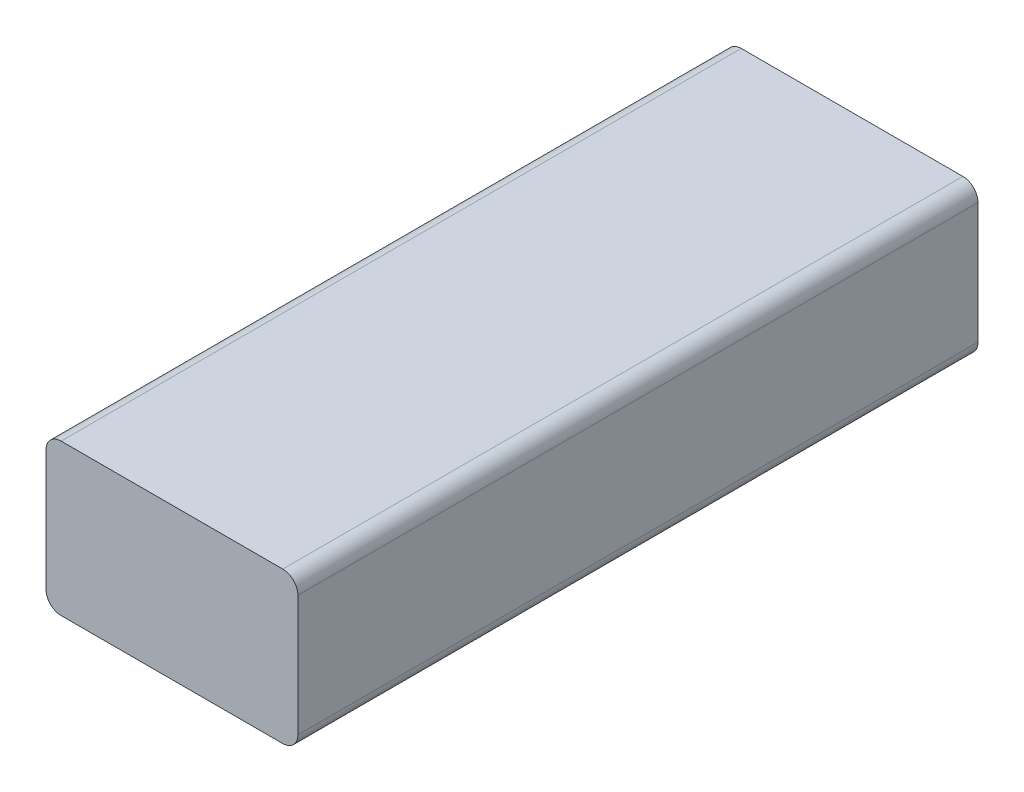
ISO-10303-21;
HEADER;
FILE_DESCRIPTION(('STEP AP214'),'2;1');
FILE_NAME('part.step','',(''),(''),'','','');
FILE_SCHEMA(('AUTOMOTIVE_DESIGN { 1 0 10303 214 1 1 1 1 }'));
ENDSEC;
DATA;
#1=APPLICATION_CONTEXT('core data for automotive mechanical design processes');
#2=APPLICATION_PROTOCOL_DEFINITION('international standard','automotive_design',2000,#1);
#3=PRODUCT_CONTEXT('',#1,'mechanical');
#4=PRODUCT('Part','Part','',(#3));
#5=PRODUCT_RELATED_PRODUCT_CATEGORY('part','',(#4));
#6=PRODUCT_DEFINITION_FORMATION('','',#4);
#7=PRODUCT_DEFINITION_CONTEXT('part definition',#1,'design');
#8=PRODUCT_DEFINITION('design','',#6,#7);
#9=PRODUCT_DEFINITION_SHAPE('','',#8);
#10=(LENGTH_UNIT() NAMED_UNIT(*) SI_UNIT(.MILLI.,.METRE.));
#11=(NAMED_UNIT(*) PLANE_ANGLE_UNIT() SI_UNIT($,.RADIAN.));
#12=(NAMED_UNIT(*) SI_UNIT($,.STERADIAN.) SOLID_ANGLE_UNIT());
#13=UNCERTAINTY_MEASURE_WITH_UNIT(LENGTH_MEASURE(1.E-05),#10,'distance_accuracy_value','');
#14=(GEOMETRIC_REPRESENTATION_CONTEXT(3) GLOBAL_UNCERTAINTY_ASSIGNED_CONTEXT((#13)) GLOBAL_UNIT_ASSIGNED_CONTEXT((#10,
#11,#12)) REPRESENTATION_CONTEXT('',''));
#15=CARTESIAN_POINT('',(0.,0.,0.));
#16=DIRECTION('',(0.,0.,1.));
#17=DIRECTION('',(1.,0.,0.));
#18=AXIS2_PLACEMENT_3D('',#15,#16,#17);
#19=CARTESIAN_POINT('',(50.,15.,-67.5));
#20=DIRECTION('',(0.,0.,1.));
#21=DIRECTION('',(1.,0.,0.));
#22=AXIS2_PLACEMENT_3D('',#19,#20,#21);
#23=PLANE('',#22);
#24=DIRECTION('',(-1.,0.,0.));
#25=VECTOR('',#24,1.);
#26=CARTESIAN_POINT('',(50.,-15.,-67.5));
#27=LINE('',#26,#25);
#28=CARTESIAN_POINT('',(47.,-15.,-67.5));
#29=VERTEX_POINT('',#28);
#30=CARTESIAN_POINT('',(3.,-15.,-67.5));
#31=VERTEX_POINT('',#30);
#32=EDGE_CURVE('E103',#29,#31,#27,.T.);
#33=ORIENTED_EDGE('',*,*,#32,.T.);
#34=CARTESIAN_POINT('',(3.,-12.,-67.5));
#35=DIRECTION('',(0.,0.,1.));
#36=DIRECTION('',(1.,0.,0.));
#37=AXIS2_PLACEMENT_3D('',#34,#35,#36);
#38=CIRCLE('',#37,3.);
#39=CARTESIAN_POINT('',(0.,-12.,-67.5));
#40=VERTEX_POINT('',#39);
#41=EDGE_CURVE('E136',#31,#40,#38,.F.);
#42=ORIENTED_EDGE('',*,*,#41,.T.);
#43=DIRECTION('',(0.,1.,0.));
#44=VECTOR('',#43,1.);
#45=CARTESIAN_POINT('',(0.,15.,-67.5));
#46=LINE('',#45,#44);
#47=CARTESIAN_POINT('',(0.,12.,-67.5));
#48=VERTEX_POINT('',#47);
#49=EDGE_CURVE('E158',#40,#48,#46,.T.);
#50=ORIENTED_EDGE('',*,*,#49,.T.);
#51=CARTESIAN_POINT('',(3.,12.,-67.5));
#52=DIRECTION('',(0.,0.,1.));
#53=DIRECTION('',(1.,0.,0.));
#54=AXIS2_PLACEMENT_3D('',#51,#52,#53);
#55=CIRCLE('',#54,3.);
#56=CARTESIAN_POINT('',(3.,15.,-67.5));
#57=VERTEX_POINT('',#56);
#58=EDGE_CURVE('E134',#48,#57,#55,.F.);
#59=ORIENTED_EDGE('',*,*,#58,.T.);
#60=DIRECTION('',(-1.,0.,0.));
#61=VECTOR('',#60,1.);
#62=CARTESIAN_POINT('',(50.,15.,-67.5));
#63=LINE('',#62,#61);
#64=CARTESIAN_POINT('',(47.,15.,-67.5));
#65=VERTEX_POINT('',#64);
#66=EDGE_CURVE('E125',#65,#57,#63,.T.);
#67=ORIENTED_EDGE('',*,*,#66,.F.);
#68=CARTESIAN_POINT('',(47.,12.,-67.5));
#69=DIRECTION('',(0.,0.,1.));
#70=DIRECTION('',(1.,0.,0.));
#71=AXIS2_PLACEMENT_3D('',#68,#69,#70);
#72=CIRCLE('',#71,3.);
#73=CARTESIAN_POINT('',(50.,12.,-67.5));
#74=VERTEX_POINT('',#73);
#75=EDGE_CURVE('E110',#65,#74,#72,.F.);
#76=ORIENTED_EDGE('',*,*,#75,.T.);
#77=DIRECTION('',(0.,1.,0.));
#78=VECTOR('',#77,1.);
#79=CARTESIAN_POINT('',(50.,15.,-67.5));
#80=LINE('',#79,#78);
#81=CARTESIAN_POINT('',(50.,-12.,-67.5));
#82=VERTEX_POINT('',#81);
#83=EDGE_CURVE('E105',#82,#74,#80,.T.);
#84=ORIENTED_EDGE('',*,*,#83,.F.);
#85=CARTESIAN_POINT('',(47.,-12.,-67.5));
#86=DIRECTION('',(0.,0.,1.));
#87=DIRECTION('',(1.,0.,0.));
#88=AXIS2_PLACEMENT_3D('',#85,#86,#87);
#89=CIRCLE('',#88,3.);
#90=EDGE_CURVE('E101',#82,#29,#89,.F.);
#91=ORIENTED_EDGE('',*,*,#90,.T.);
#92=EDGE_LOOP('',(#33,#42,#50,#59,#67,#76,#84,#91));
#93=FACE_BOUND('',#92,.T.);
#94=ADVANCED_FACE('F34',(#93),#23,.F.);
#95=CARTESIAN_POINT('',(50.,15.,67.5));
#96=DIRECTION('',(0.,-1.,0.));
#97=DIRECTION('',(0.,0.,-1.));
#98=AXIS2_PLACEMENT_3D('',#95,#96,#97);
#99=PLANE('',#98);
#100=ORIENTED_EDGE('',*,*,#66,.T.);
#101=DIRECTION('',(0.,0.,1.));
#102=VECTOR('',#101,1.);
#103=CARTESIAN_POINT('',(3.,15.,67.5));
#104=LINE('',#103,#102);
#105=CARTESIAN_POINT('',(3.,15.,67.5));
#106=VERTEX_POINT('',#105);
#107=EDGE_CURVE('E149',#57,#106,#104,.T.);
#108=ORIENTED_EDGE('',*,*,#107,.T.);
#109=DIRECTION('',(-1.,0.,0.));
#110=VECTOR('',#109,1.);
#111=CARTESIAN_POINT('',(50.,15.,67.5));
#112=LINE('',#111,#110);
#113=CARTESIAN_POINT('',(47.,15.,67.5));
#114=VERTEX_POINT('',#113);
#115=EDGE_CURVE('E129',#114,#106,#112,.T.);
#116=ORIENTED_EDGE('',*,*,#115,.F.);
#117=DIRECTION('',(0.,0.,1.));
#118=VECTOR('',#117,1.);
#119=CARTESIAN_POINT('',(47.,15.,-67.5));
#120=LINE('',#119,#118);
#121=EDGE_CURVE('E147',#114,#65,#120,.F.);
#122=ORIENTED_EDGE('',*,*,#121,.T.);
#123=EDGE_LOOP('',(#100,#108,#116,#122));
#124=FACE_BOUND('',#123,.T.);
#125=ADVANCED_FACE('F167',(#124),#99,.F.);
#126=CARTESIAN_POINT('',(50.,15.,67.5));
#127=DIRECTION('',(0.,0.,-1.));
#128=DIRECTION('',(-1.,0.,0.));
#129=AXIS2_PLACEMENT_3D('',#126,#127,#128);
#130=PLANE('',#129);
#131=DIRECTION('',(0.,-1.,0.));
#132=VECTOR('',#131,1.);
#133=CARTESIAN_POINT('',(0.,15.,67.5));
#134=LINE('',#133,#132);
#135=CARTESIAN_POINT('',(0.,12.,67.5));
#136=VERTEX_POINT('',#135);
#137=CARTESIAN_POINT('',(0.,-12.,67.5));
#138=VERTEX_POINT('',#137);
#139=EDGE_CURVE('E155',#136,#138,#134,.T.);
#140=ORIENTED_EDGE('',*,*,#139,.T.);
#141=CARTESIAN_POINT('',(3.,-12.,67.5));
#142=DIRECTION('',(0.,0.,-1.));
#143=DIRECTION('',(-1.,0.,0.));
#144=AXIS2_PLACEMENT_3D('',#141,#142,#143);
#145=CIRCLE('',#144,3.);
#146=CARTESIAN_POINT('',(3.,-15.,67.5));
#147=VERTEX_POINT('',#146);
#148=EDGE_CURVE('E145',#138,#147,#145,.F.);
#149=ORIENTED_EDGE('',*,*,#148,.T.);
#150=DIRECTION('',(-1.,0.,0.));
#151=VECTOR('',#150,1.);
#152=CARTESIAN_POINT('',(50.,-15.,67.5));
#153=LINE('',#152,#151);
#154=CARTESIAN_POINT('',(47.,-15.,67.5));
#155=VERTEX_POINT('',#154);
#156=EDGE_CURVE('E120',#155,#147,#153,.T.);
#157=ORIENTED_EDGE('',*,*,#156,.F.);
#158=CARTESIAN_POINT('',(47.,-12.,67.5));
#159=DIRECTION('',(0.,0.,-1.));
#160=DIRECTION('',(-1.,0.,0.));
#161=AXIS2_PLACEMENT_3D('',#158,#159,#160);
#162=CIRCLE('',#161,3.);
#163=CARTESIAN_POINT('',(50.,-12.,67.5));
#164=VERTEX_POINT('',#163);
#165=EDGE_CURVE('E124',#155,#164,#162,.F.);
#166=ORIENTED_EDGE('',*,*,#165,.T.);
#167=DIRECTION('',(0.,-1.,0.));
#168=VECTOR('',#167,1.);
#169=CARTESIAN_POINT('',(50.,15.,67.5));
#170=LINE('',#169,#168);
#171=CARTESIAN_POINT('',(50.,12.,67.5));
#172=VERTEX_POINT('',#171);
#173=EDGE_CURVE('E121',#172,#164,#170,.T.);
#174=ORIENTED_EDGE('',*,*,#173,.F.);
#175=CARTESIAN_POINT('',(47.,12.,67.5));
#176=DIRECTION('',(0.,0.,-1.));
#177=DIRECTION('',(-1.,0.,0.));
#178=AXIS2_PLACEMENT_3D('',#175,#176,#177);
#179=CIRCLE('',#178,3.);
#180=EDGE_CURVE('E57',#172,#114,#179,.F.);
#181=ORIENTED_EDGE('',*,*,#180,.T.);
#182=ORIENTED_EDGE('',*,*,#115,.T.);
#183=CARTESIAN_POINT('',(3.,12.,67.5));
#184=DIRECTION('',(0.,0.,-1.));
#185=DIRECTION('',(-1.,0.,0.));
#186=AXIS2_PLACEMENT_3D('',#183,#184,#185);
#187=CIRCLE('',#186,3.);
#188=EDGE_CURVE('E49',#106,#136,#187,.F.);
#189=ORIENTED_EDGE('',*,*,#188,.T.);
#190=EDGE_LOOP('',(#140,#149,#157,#166,#174,#181,#182,#189));
#191=FACE_BOUND('',#190,.T.);
#192=ADVANCED_FACE('F163',(#191),#130,.F.);
#193=CARTESIAN_POINT('',(50.,-15.,67.5));
#194=DIRECTION('',(0.,1.,0.));
#195=DIRECTION('',(0.,0.,1.));
#196=AXIS2_PLACEMENT_3D('',#193,#194,#195);
#197=PLANE('',#196);
#198=ORIENTED_EDGE('',*,*,#156,.T.);
#199=DIRECTION('',(0.,0.,-1.));
#200=VECTOR('',#199,1.);
#201=CARTESIAN_POINT('',(3.,-15.,67.5));
#202=LINE('',#201,#200);
#203=EDGE_CURVE('E111',#147,#31,#202,.T.);
#204=ORIENTED_EDGE('',*,*,#203,.T.);
#205=ORIENTED_EDGE('',*,*,#32,.F.);
#206=DIRECTION('',(0.,0.,-1.));
#207=VECTOR('',#206,1.);
#208=CARTESIAN_POINT('',(47.,-15.,67.5));
#209=LINE('',#208,#207);
#210=EDGE_CURVE('E117',#29,#155,#209,.F.);
#211=ORIENTED_EDGE('',*,*,#210,.T.);
#212=EDGE_LOOP('',(#198,#204,#205,#211));
#213=FACE_BOUND('',#212,.T.);
#214=ADVANCED_FACE('F116',(#213),#197,.F.);
#215=CARTESIAN_POINT('',(50.,0.,0.));
#216=DIRECTION('',(1.,0.,0.));
#217=DIRECTION('',(0.,0.,-1.));
#218=AXIS2_PLACEMENT_3D('',#215,#216,#217);
#219=PLANE('',#218);
#220=ORIENTED_EDGE('',*,*,#83,.T.);
#221=DIRECTION('',(0.,0.,1.));
#222=VECTOR('',#221,1.);
#223=CARTESIAN_POINT('',(50.,12.,67.5));
#224=LINE('',#223,#222);
#225=EDGE_CURVE('E11',#74,#172,#224,.T.);
#226=ORIENTED_EDGE('',*,*,#225,.T.);
#227=ORIENTED_EDGE('',*,*,#173,.T.);
#228=DIRECTION('',(0.,0.,-1.));
#229=VECTOR('',#228,1.);
#230=CARTESIAN_POINT('',(50.,-12.,-67.5));
#231=LINE('',#230,#229);
#232=EDGE_CURVE('E42',#164,#82,#231,.T.);
#233=ORIENTED_EDGE('',*,*,#232,.T.);
#234=EDGE_LOOP('',(#220,#226,#227,#233));
#235=FACE_BOUND('',#234,.T.);
#236=ADVANCED_FACE('F152',(#235),#219,.T.);
#237=CARTESIAN_POINT('',(0.,0.,0.));
#238=DIRECTION('',(1.,0.,0.));
#239=DIRECTION('',(0.,0.,-1.));
#240=AXIS2_PLACEMENT_3D('',#237,#238,#239);
#241=PLANE('',#240);
#242=ORIENTED_EDGE('',*,*,#49,.F.);
#243=DIRECTION('',(0.,0.,-1.));
#244=VECTOR('',#243,1.);
#245=CARTESIAN_POINT('',(0.,-12.,0.));
#246=LINE('',#245,#244);
#247=EDGE_CURVE('E140',#40,#138,#246,.F.);
#248=ORIENTED_EDGE('',*,*,#247,.T.);
#249=ORIENTED_EDGE('',*,*,#139,.F.);
#250=DIRECTION('',(0.,0.,1.));
#251=VECTOR('',#250,1.);
#252=CARTESIAN_POINT('',(0.,12.,0.));
#253=LINE('',#252,#251);
#254=EDGE_CURVE('E138',#136,#48,#253,.F.);
#255=ORIENTED_EDGE('',*,*,#254,.T.);
#256=EDGE_LOOP('',(#242,#248,#249,#255));
#257=FACE_BOUND('',#256,.T.);
#258=ADVANCED_FACE('F176',(#257),#241,.F.);
#259=CARTESIAN_POINT('',(3.,-12.,67.5));
#260=DIRECTION('',(0.,0.,-1.));
#261=DIRECTION('',(-1.,0.,0.));
#262=AXIS2_PLACEMENT_3D('',#259,#260,#261);
#263=CYLINDRICAL_SURFACE('',#262,3.);
#264=ORIENTED_EDGE('',*,*,#148,.F.);
#265=ORIENTED_EDGE('',*,*,#247,.F.);
#266=ORIENTED_EDGE('',*,*,#41,.F.);
#267=ORIENTED_EDGE('',*,*,#203,.F.);
#268=EDGE_LOOP('',(#264,#265,#266,#267));
#269=FACE_BOUND('',#268,.T.);
#270=ADVANCED_FACE('F180',(#269),#263,.T.);
#271=CARTESIAN_POINT('',(3.,12.,67.5));
#272=DIRECTION('',(0.,0.,1.));
#273=DIRECTION('',(1.,0.,0.));
#274=AXIS2_PLACEMENT_3D('',#271,#272,#273);
#275=CYLINDRICAL_SURFACE('',#274,3.);
#276=ORIENTED_EDGE('',*,*,#58,.F.);
#277=ORIENTED_EDGE('',*,*,#254,.F.);
#278=ORIENTED_EDGE('',*,*,#188,.F.);
#279=ORIENTED_EDGE('',*,*,#107,.F.);
#280=EDGE_LOOP('',(#276,#277,#278,#279));
#281=FACE_BOUND('',#280,.T.);
#282=ADVANCED_FACE('F173',(#281),#275,.T.);
#283=CARTESIAN_POINT('',(47.,12.,0.));
#284=DIRECTION('',(0.,0.,-1.));
#285=DIRECTION('',(-1.,0.,0.));
#286=AXIS2_PLACEMENT_3D('',#283,#284,#285);
#287=CYLINDRICAL_SURFACE('',#286,3.);
#288=ORIENTED_EDGE('',*,*,#75,.F.);
#289=ORIENTED_EDGE('',*,*,#121,.F.);
#290=ORIENTED_EDGE('',*,*,#180,.F.);
#291=ORIENTED_EDGE('',*,*,#225,.F.);
#292=EDGE_LOOP('',(#288,#289,#290,#291));
#293=FACE_BOUND('',#292,.T.);
#294=ADVANCED_FACE('F171',(#293),#287,.T.);
#295=CARTESIAN_POINT('',(47.,-12.,0.));
#296=DIRECTION('',(0.,0.,1.));
#297=DIRECTION('',(1.,0.,0.));
#298=AXIS2_PLACEMENT_3D('',#295,#296,#297);
#299=CYLINDRICAL_SURFACE('',#298,3.);
#300=ORIENTED_EDGE('',*,*,#165,.F.);
#301=ORIENTED_EDGE('',*,*,#210,.F.);
#302=ORIENTED_EDGE('',*,*,#90,.F.);
#303=ORIENTED_EDGE('',*,*,#232,.F.);
#304=EDGE_LOOP('',(#300,#301,#302,#303));
#305=FACE_BOUND('',#304,.T.);
#306=ADVANCED_FACE('F36',(#305),#299,.T.);
#307=CLOSED_SHELL('',(#94,#125,#192,#214,#236,#258,#270,#282,#294,#306));
#308=MANIFOLD_SOLID_BREP('B2',#307);
#309=ADVANCED_BREP_SHAPE_REPRESENTATION('',(#18,#308),#14);
#310=SHAPE_DEFINITION_REPRESENTATION(#9,#309);
ENDSEC;
END-ISO-10303-21;
